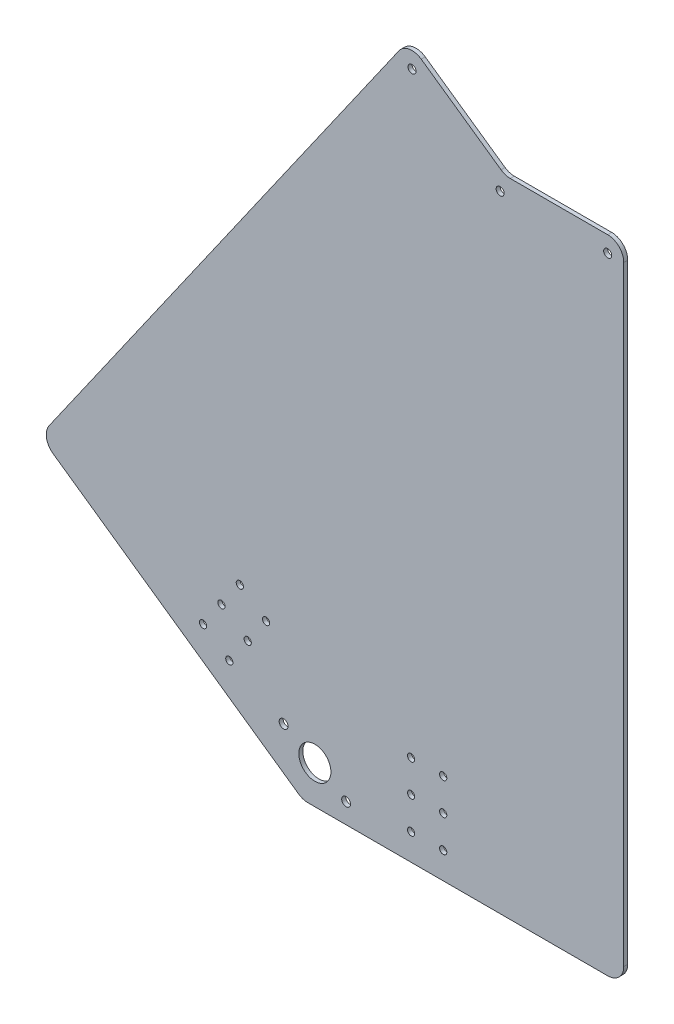
ISO-10303-21;
HEADER;
FILE_DESCRIPTION(('STEP AP214'),'2;1');
FILE_NAME('part.step','',(''),(''),'','','');
FILE_SCHEMA(('AUTOMOTIVE_DESIGN { 1 0 10303 214 1 1 1 1 }'));
ENDSEC;
DATA;
#1=APPLICATION_CONTEXT('core data for automotive mechanical design processes');
#2=APPLICATION_PROTOCOL_DEFINITION('international standard','automotive_design',2000,#1);
#3=PRODUCT_CONTEXT('',#1,'mechanical');
#4=PRODUCT('Part','Part','',(#3));
#5=PRODUCT_RELATED_PRODUCT_CATEGORY('part','',(#4));
#6=PRODUCT_DEFINITION_FORMATION('','',#4);
#7=PRODUCT_DEFINITION_CONTEXT('part definition',#1,'design');
#8=PRODUCT_DEFINITION('design','',#6,#7);
#9=PRODUCT_DEFINITION_SHAPE('','',#8);
#10=(LENGTH_UNIT() NAMED_UNIT(*) SI_UNIT(.MILLI.,.METRE.));
#11=(NAMED_UNIT(*) PLANE_ANGLE_UNIT() SI_UNIT($,.RADIAN.));
#12=(NAMED_UNIT(*) SI_UNIT($,.STERADIAN.) SOLID_ANGLE_UNIT());
#13=UNCERTAINTY_MEASURE_WITH_UNIT(LENGTH_MEASURE(1.E-05),#10,'distance_accuracy_value','');
#14=(GEOMETRIC_REPRESENTATION_CONTEXT(3) GLOBAL_UNCERTAINTY_ASSIGNED_CONTEXT((#13)) GLOBAL_UNIT_ASSIGNED_CONTEXT((#10,
#11,#12)) REPRESENTATION_CONTEXT('',''));
#15=CARTESIAN_POINT('',(0.,0.,0.));
#16=DIRECTION('',(0.,0.,1.));
#17=DIRECTION('',(1.,0.,0.));
#18=AXIS2_PLACEMENT_3D('',#15,#16,#17);
#19=CARTESIAN_POINT('',(-327.660817715596,229.430574540419,-5.));
#20=DIRECTION('',(-0.573576436351047,-0.819152044288991,0.));
#21=DIRECTION('',(0.819152044288991,-0.573576436351047,0.));
#22=AXIS2_PLACEMENT_3D('',#19,#20,#21);
#23=PLANE('',#22);
#24=DIRECTION('',(0.819152044288991,-0.573576436351047,0.));
#25=VECTOR('',#24,1.);
#26=CARTESIAN_POINT('',(-327.660817715596,229.430574540419,-5.));
#27=LINE('',#26,#25);
#28=CARTESIAN_POINT('',(-311.277776829817,217.959045813398,-5.));
#29=VERTEX_POINT('',#28);
#30=CARTESIAN_POINT('',(-5.16555294944127,3.61695911422019,-5.));
#31=VERTEX_POINT('',#30);
#32=EDGE_CURVE('E236',#29,#31,#27,.T.);
#33=ORIENTED_EDGE('',*,*,#32,.T.);
#34=DIRECTION('',(0.,0.,1.));
#35=VECTOR('',#34,1.);
#36=CARTESIAN_POINT('',(-5.16555294944127,3.61695911422016,-5.));
#37=LINE('',#36,#35);
#38=CARTESIAN_POINT('',(-5.16555294944127,3.61695911422019,0.));
#39=VERTEX_POINT('',#38);
#40=EDGE_CURVE('E183',#31,#39,#37,.T.);
#41=ORIENTED_EDGE('',*,*,#40,.T.);
#42=DIRECTION('',(0.819152044288991,-0.573576436351047,0.));
#43=VECTOR('',#42,1.);
#44=CARTESIAN_POINT('',(-327.660817715596,229.430574540419,0.));
#45=LINE('',#44,#43);
#46=CARTESIAN_POINT('',(-311.277776829817,217.959045813398,0.));
#47=VERTEX_POINT('',#46);
#48=EDGE_CURVE('E130',#47,#39,#45,.T.);
#49=ORIENTED_EDGE('',*,*,#48,.F.);
#50=DIRECTION('',(0.,0.,1.));
#51=VECTOR('',#50,1.);
#52=CARTESIAN_POINT('',(-311.277776829817,217.959045813398,-5.));
#53=LINE('',#52,#51);
#54=EDGE_CURVE('E181',#47,#29,#53,.F.);
#55=ORIENTED_EDGE('',*,*,#54,.T.);
#56=EDGE_LOOP('',(#33,#41,#49,#55));
#57=FACE_BOUND('',#56,.T.);
#58=ADVANCED_FACE('F36',(#57),#23,.T.);
#59=CARTESIAN_POINT('',(131.200331365241,884.752209971612,-5.));
#60=DIRECTION('',(-0.819152044288991,0.573576436351047,0.));
#61=DIRECTION('',(-0.573576436351047,-0.819152044288991,0.));
#62=AXIS2_PLACEMENT_3D('',#59,#60,#61);
#63=PLANE('',#62);
#64=DIRECTION('',(-0.573576436351047,-0.819152044288991,0.));
#65=VECTOR('',#64,1.);
#66=CARTESIAN_POINT('',(131.200331365241,884.752209971612,-5.));
#67=LINE('',#66,#65);
#68=CARTESIAN_POINT('',(119.72880263822,868.369169085832,-5.));
#69=VERTEX_POINT('',#68);
#70=CARTESIAN_POINT('',(-316.189288988576,245.813615426199,-5.));
#71=VERTEX_POINT('',#70);
#72=EDGE_CURVE('E151',#69,#71,#67,.T.);
#73=ORIENTED_EDGE('',*,*,#72,.T.);
#74=DIRECTION('',(0.,0.,1.));
#75=VECTOR('',#74,1.);
#76=CARTESIAN_POINT('',(-316.189288988575,245.813615426199,-5.));
#77=LINE('',#76,#75);
#78=CARTESIAN_POINT('',(-316.189288988576,245.813615426199,0.));
#79=VERTEX_POINT('',#78);
#80=EDGE_CURVE('E187',#71,#79,#77,.T.);
#81=ORIENTED_EDGE('',*,*,#80,.T.);
#82=DIRECTION('',(-0.573576436351047,-0.819152044288991,0.));
#83=VECTOR('',#82,1.);
#84=CARTESIAN_POINT('',(131.200331365241,884.752209971612,0.));
#85=LINE('',#84,#83);
#86=CARTESIAN_POINT('',(119.72880263822,868.369169085832,0.));
#87=VERTEX_POINT('',#86);
#88=EDGE_CURVE('E159',#87,#79,#85,.T.);
#89=ORIENTED_EDGE('',*,*,#88,.F.);
#90=DIRECTION('',(0.,0.,1.));
#91=VECTOR('',#90,1.);
#92=CARTESIAN_POINT('',(119.72880263822,868.369169085832,-5.));
#93=LINE('',#92,#91);
#94=EDGE_CURVE('E185',#87,#69,#93,.F.);
#95=ORIENTED_EDGE('',*,*,#94,.T.);
#96=EDGE_LOOP('',(#73,#81,#89,#95));
#97=FACE_BOUND('',#96,.T.);
#98=ADVANCED_FACE('F404',(#97),#63,.T.);
#99=CARTESIAN_POINT('',(252.239031103188,800.,-5.));
#100=DIRECTION('',(0.573576436351046,0.819152044288992,0.));
#101=DIRECTION('',(-0.819152044288992,0.573576436351046,0.));
#102=AXIS2_PLACEMENT_3D('',#99,#100,#101);
#103=PLANE('',#102);
#104=DIRECTION('',(-0.819152044288992,0.573576436351046,0.));
#105=VECTOR('',#104,1.);
#106=CARTESIAN_POINT('',(252.239031103188,800.,0.));
#107=LINE('',#106,#105);
#108=CARTESIAN_POINT('',(247.073478153746,803.61695911422,0.));
#109=VERTEX_POINT('',#108);
#110=CARTESIAN_POINT('',(147.583372251021,873.280681244591,0.));
#111=VERTEX_POINT('',#110);
#112=EDGE_CURVE('E201',#109,#111,#107,.T.);
#113=ORIENTED_EDGE('',*,*,#112,.F.);
#114=DIRECTION('',(0.,0.,1.));
#115=VECTOR('',#114,1.);
#116=CARTESIAN_POINT('',(247.073478153746,803.61695911422,-5.));
#117=LINE('',#116,#115);
#118=CARTESIAN_POINT('',(247.073478153746,803.61695911422,-5.));
#119=VERTEX_POINT('',#118);
#120=EDGE_CURVE('E197',#109,#119,#117,.F.);
#121=ORIENTED_EDGE('',*,*,#120,.T.);
#122=DIRECTION('',(-0.819152044288992,0.573576436351046,0.));
#123=VECTOR('',#122,1.);
#124=CARTESIAN_POINT('',(252.239031103188,800.,-5.));
#125=LINE('',#124,#123);
#126=CARTESIAN_POINT('',(147.583372251021,873.280681244591,-5.));
#127=VERTEX_POINT('',#126);
#128=EDGE_CURVE('E156',#119,#127,#125,.T.);
#129=ORIENTED_EDGE('',*,*,#128,.T.);
#130=DIRECTION('',(0.,0.,1.));
#131=VECTOR('',#130,1.);
#132=CARTESIAN_POINT('',(147.583372251021,873.280681244591,-5.));
#133=LINE('',#132,#131);
#134=EDGE_CURVE('E194',#127,#111,#133,.T.);
#135=ORIENTED_EDGE('',*,*,#134,.T.);
#136=EDGE_LOOP('',(#113,#121,#129,#135));
#137=FACE_BOUND('',#136,.T.);
#138=ADVANCED_FACE('F207',(#137),#103,.T.);
#139=CARTESIAN_POINT('',(400.,800.,-5.));
#140=DIRECTION('',(0.,1.,0.));
#141=DIRECTION('',(0.,0.,1.));
#142=AXIS2_PLACEMENT_3D('',#139,#140,#141);
#143=PLANE('',#142);
#144=DIRECTION('',(-1.,0.,0.));
#145=VECTOR('',#144,1.);
#146=CARTESIAN_POINT('',(400.,800.,-5.));
#147=LINE('',#146,#145);
#148=CARTESIAN_POINT('',(380.,800.,-5.));
#149=VERTEX_POINT('',#148);
#150=CARTESIAN_POINT('',(258.545006880767,800.,-5.));
#151=VERTEX_POINT('',#150);
#152=EDGE_CURVE('E212',#149,#151,#147,.T.);
#153=ORIENTED_EDGE('',*,*,#152,.T.);
#154=DIRECTION('',(0.,0.,1.));
#155=VECTOR('',#154,1.);
#156=CARTESIAN_POINT('',(258.545006880767,800.,0.));
#157=LINE('',#156,#155);
#158=CARTESIAN_POINT('',(258.545006880767,800.,0.));
#159=VERTEX_POINT('',#158);
#160=EDGE_CURVE('E191',#151,#159,#157,.T.);
#161=ORIENTED_EDGE('',*,*,#160,.T.);
#162=DIRECTION('',(-1.,0.,0.));
#163=VECTOR('',#162,1.);
#164=CARTESIAN_POINT('',(400.,800.,0.));
#165=LINE('',#164,#163);
#166=CARTESIAN_POINT('',(380.,800.,0.));
#167=VERTEX_POINT('',#166);
#168=EDGE_CURVE('E202',#167,#159,#165,.T.);
#169=ORIENTED_EDGE('',*,*,#168,.F.);
#170=DIRECTION('',(0.,0.,1.));
#171=VECTOR('',#170,1.);
#172=CARTESIAN_POINT('',(380.,800.,-5.));
#173=LINE('',#172,#171);
#174=EDGE_CURVE('E56',#167,#149,#173,.F.);
#175=ORIENTED_EDGE('',*,*,#174,.T.);
#176=EDGE_LOOP('',(#153,#161,#169,#175));
#177=FACE_BOUND('',#176,.T.);
#178=ADVANCED_FACE('F211',(#177),#143,.T.);
#179=CARTESIAN_POINT('',(400.,0.,-5.));
#180=DIRECTION('',(1.,0.,0.));
#181=DIRECTION('',(0.,0.,-1.));
#182=AXIS2_PLACEMENT_3D('',#179,#180,#181);
#183=PLANE('',#182);
#184=DIRECTION('',(0.,1.,0.));
#185=VECTOR('',#184,1.);
#186=CARTESIAN_POINT('',(400.,0.,0.));
#187=LINE('',#186,#185);
#188=CARTESIAN_POINT('',(400.,20.,0.));
#189=VERTEX_POINT('',#188);
#190=CARTESIAN_POINT('',(400.,780.,0.));
#191=VERTEX_POINT('',#190);
#192=EDGE_CURVE('E146',#189,#191,#187,.T.);
#193=ORIENTED_EDGE('',*,*,#192,.F.);
#194=DIRECTION('',(0.,0.,1.));
#195=VECTOR('',#194,1.);
#196=CARTESIAN_POINT('',(400.,20.,-5.));
#197=LINE('',#196,#195);
#198=CARTESIAN_POINT('',(400.,20.,-5.));
#199=VERTEX_POINT('',#198);
#200=EDGE_CURVE('E170',#189,#199,#197,.F.);
#201=ORIENTED_EDGE('',*,*,#200,.T.);
#202=DIRECTION('',(0.,1.,0.));
#203=VECTOR('',#202,1.);
#204=CARTESIAN_POINT('',(400.,0.,-5.));
#205=LINE('',#204,#203);
#206=CARTESIAN_POINT('',(400.,780.,-5.));
#207=VERTEX_POINT('',#206);
#208=EDGE_CURVE('E214',#199,#207,#205,.T.);
#209=ORIENTED_EDGE('',*,*,#208,.T.);
#210=DIRECTION('',(0.,0.,1.));
#211=VECTOR('',#210,1.);
#212=CARTESIAN_POINT('',(400.,780.,-5.));
#213=LINE('',#212,#211);
#214=EDGE_CURVE('E167',#207,#191,#213,.T.);
#215=ORIENTED_EDGE('',*,*,#214,.T.);
#216=EDGE_LOOP('',(#193,#201,#209,#215));
#217=FACE_BOUND('',#216,.T.);
#218=ADVANCED_FACE('F229',(#217),#183,.T.);
#219=CARTESIAN_POINT('',(0.,0.,-5.));
#220=DIRECTION('',(0.,-1.,0.));
#221=DIRECTION('',(0.,0.,-1.));
#222=AXIS2_PLACEMENT_3D('',#219,#220,#221);
#223=PLANE('',#222);
#224=DIRECTION('',(1.,0.,0.));
#225=VECTOR('',#224,1.);
#226=CARTESIAN_POINT('',(0.,0.,-5.));
#227=LINE('',#226,#225);
#228=CARTESIAN_POINT('',(6.30597577757969,0.,-5.));
#229=VERTEX_POINT('',#228);
#230=CARTESIAN_POINT('',(380.,0.,-5.));
#231=VERTEX_POINT('',#230);
#232=EDGE_CURVE('E218',#229,#231,#227,.T.);
#233=ORIENTED_EDGE('',*,*,#232,.T.);
#234=DIRECTION('',(0.,0.,1.));
#235=VECTOR('',#234,1.);
#236=CARTESIAN_POINT('',(380.,0.,-5.));
#237=LINE('',#236,#235);
#238=CARTESIAN_POINT('',(380.,0.,0.));
#239=VERTEX_POINT('',#238);
#240=EDGE_CURVE('E145',#231,#239,#237,.T.);
#241=ORIENTED_EDGE('',*,*,#240,.T.);
#242=DIRECTION('',(1.,0.,0.));
#243=VECTOR('',#242,1.);
#244=CARTESIAN_POINT('',(0.,0.,0.));
#245=LINE('',#244,#243);
#246=CARTESIAN_POINT('',(6.30597577757969,0.,0.));
#247=VERTEX_POINT('',#246);
#248=EDGE_CURVE('E128',#247,#239,#245,.T.);
#249=ORIENTED_EDGE('',*,*,#248,.F.);
#250=DIRECTION('',(0.,0.,1.));
#251=VECTOR('',#250,1.);
#252=CARTESIAN_POINT('',(6.30597577757969,0.,-5.));
#253=LINE('',#252,#251);
#254=EDGE_CURVE('E142',#247,#229,#253,.F.);
#255=ORIENTED_EDGE('',*,*,#254,.T.);
#256=EDGE_LOOP('',(#233,#241,#249,#255));
#257=FACE_BOUND('',#256,.T.);
#258=ADVANCED_FACE('F141',(#257),#223,.T.);
#259=CARTESIAN_POINT('',(0.,0.,-5.));
#260=DIRECTION('',(0.,0.,-1.));
#261=DIRECTION('',(-1.,0.,0.));
#262=AXIS2_PLACEMENT_3D('',#259,#260,#261);
#263=PLANE('',#262);
#264=CARTESIAN_POINT('',(-124.404492941578,127.394525173978,-5.));
#265=DIRECTION('',(0.,0.,1.));
#266=DIRECTION('',(1.,0.,0.));
#267=AXIS2_PLACEMENT_3D('',#264,#265,#266);
#268=CIRCLE('',#267,4.5);
#269=CARTESIAN_POINT('',(-119.904492941578,127.394525173978,-5.));
#270=VERTEX_POINT('',#269);
#271=EDGE_CURVE('E341',#270,#270,#268,.T.);
#272=ORIENTED_EDGE('',*,*,#271,.T.);
#273=EDGE_LOOP('',(#272));
#274=FACE_BOUND('',#273,.T.);
#275=CARTESIAN_POINT('',(-78.5183780334941,192.926688717097,-5.));
#276=DIRECTION('',(0.,0.,1.));
#277=DIRECTION('',(1.,0.,0.));
#278=AXIS2_PLACEMENT_3D('',#275,#276,#277);
#279=CIRCLE('',#278,4.5);
#280=CARTESIAN_POINT('',(-74.0183780334941,192.926688717097,-5.));
#281=VERTEX_POINT('',#280);
#282=EDGE_CURVE('E335',#281,#281,#279,.T.);
#283=ORIENTED_EDGE('',*,*,#282,.T.);
#284=EDGE_LOOP('',(#283));
#285=FACE_BOUND('',#284,.T.);
#286=CARTESIAN_POINT('',(-45.7522962619345,169.983631263055,-5.));
#287=DIRECTION('',(0.,0.,1.));
#288=DIRECTION('',(1.,0.,0.));
#289=AXIS2_PLACEMENT_3D('',#286,#287,#288);
#290=CIRCLE('',#289,4.5);
#291=CARTESIAN_POINT('',(-41.2522962619345,169.983631263055,-5.));
#292=VERTEX_POINT('',#291);
#293=EDGE_CURVE('E329',#292,#292,#290,.T.);
#294=ORIENTED_EDGE('',*,*,#293,.T.);
#295=EDGE_LOOP('',(#294));
#296=FACE_BOUND('',#295,.T.);
#297=CARTESIAN_POINT('',(-91.6384111700183,104.451467719936,-5.));
#298=DIRECTION('',(0.,0.,1.));
#299=DIRECTION('',(1.,0.,0.));
#300=AXIS2_PLACEMENT_3D('',#297,#298,#299);
#301=CIRCLE('',#300,4.5);
#302=CARTESIAN_POINT('',(-87.1384111700182,104.451467719936,-5.));
#303=VERTEX_POINT('',#302);
#304=EDGE_CURVE('E323',#303,#303,#301,.T.);
#305=ORIENTED_EDGE('',*,*,#304,.T.);
#306=EDGE_LOOP('',(#305));
#307=FACE_BOUND('',#306,.T.);
#308=CARTESIAN_POINT('',(-101.461435487536,160.160606945537,-5.));
#309=DIRECTION('',(0.,0.,1.));
#310=DIRECTION('',(1.,0.,0.));
#311=AXIS2_PLACEMENT_3D('',#308,#309,#310);
#312=CIRCLE('',#311,4.5);
#313=CARTESIAN_POINT('',(-96.961435487536,160.160606945537,-5.));
#314=VERTEX_POINT('',#313);
#315=EDGE_CURVE('E317',#314,#314,#312,.T.);
#316=ORIENTED_EDGE('',*,*,#315,.T.);
#317=EDGE_LOOP('',(#316));
#318=FACE_BOUND('',#317,.T.);
#319=CARTESIAN_POINT('',(-68.6953537159764,137.217549491495,-5.));
#320=DIRECTION('',(0.,0.,1.));
#321=DIRECTION('',(1.,0.,0.));
#322=AXIS2_PLACEMENT_3D('',#319,#320,#321);
#323=CIRCLE('',#322,4.5);
#324=CARTESIAN_POINT('',(-64.1953537159764,137.217549491495,-5.));
#325=VERTEX_POINT('',#324);
#326=EDGE_CURVE('E311',#325,#325,#323,.T.);
#327=ORIENTED_EDGE('',*,*,#326,.T.);
#328=EDGE_LOOP('',(#327));
#329=FACE_BOUND('',#328,.T.);
#330=CARTESIAN_POINT('',(134.976692471753,113.,-5.));
#331=DIRECTION('',(0.,0.,1.));
#332=DIRECTION('',(1.,0.,0.));
#333=AXIS2_PLACEMENT_3D('',#330,#331,#332);
#334=CIRCLE('',#333,4.5);
#335=CARTESIAN_POINT('',(139.476692471753,113.,-5.));
#336=VERTEX_POINT('',#335);
#337=EDGE_CURVE('E305',#336,#336,#334,.T.);
#338=ORIENTED_EDGE('',*,*,#337,.T.);
#339=EDGE_LOOP('',(#338));
#340=FACE_BOUND('',#339,.T.);
#341=CARTESIAN_POINT('',(174.976692471753,33.,-5.));
#342=DIRECTION('',(0.,0.,1.));
#343=DIRECTION('',(1.,0.,0.));
#344=AXIS2_PLACEMENT_3D('',#341,#342,#343);
#345=CIRCLE('',#344,4.5);
#346=CARTESIAN_POINT('',(179.476692471753,33.,-5.));
#347=VERTEX_POINT('',#346);
#348=EDGE_CURVE('E299',#347,#347,#345,.T.);
#349=ORIENTED_EDGE('',*,*,#348,.T.);
#350=EDGE_LOOP('',(#349));
#351=FACE_BOUND('',#350,.T.);
#352=CARTESIAN_POINT('',(134.976692471753,33.,-5.));
#353=DIRECTION('',(0.,0.,1.));
#354=DIRECTION('',(1.,0.,0.));
#355=AXIS2_PLACEMENT_3D('',#352,#353,#354);
#356=CIRCLE('',#355,4.5);
#357=CARTESIAN_POINT('',(139.476692471753,33.,-5.));
#358=VERTEX_POINT('',#357);
#359=EDGE_CURVE('E293',#358,#358,#356,.T.);
#360=ORIENTED_EDGE('',*,*,#359,.T.);
#361=EDGE_LOOP('',(#360));
#362=FACE_BOUND('',#361,.T.);
#363=CARTESIAN_POINT('',(174.976692471753,113.,-5.));
#364=DIRECTION('',(0.,0.,1.));
#365=DIRECTION('',(1.,0.,0.));
#366=AXIS2_PLACEMENT_3D('',#363,#364,#365);
#367=CIRCLE('',#366,4.5);
#368=CARTESIAN_POINT('',(179.476692471753,113.,-5.));
#369=VERTEX_POINT('',#368);
#370=EDGE_CURVE('E287',#369,#369,#367,.T.);
#371=ORIENTED_EDGE('',*,*,#370,.T.);
#372=EDGE_LOOP('',(#371));
#373=FACE_BOUND('',#372,.T.);
#374=CARTESIAN_POINT('',(134.976692471753,73.,-5.));
#375=DIRECTION('',(0.,0.,1.));
#376=DIRECTION('',(1.,0.,0.));
#377=AXIS2_PLACEMENT_3D('',#374,#375,#376);
#378=CIRCLE('',#377,4.5);
#379=CARTESIAN_POINT('',(139.476692471753,73.,-5.));
#380=VERTEX_POINT('',#379);
#381=EDGE_CURVE('E281',#380,#380,#378,.T.);
#382=ORIENTED_EDGE('',*,*,#381,.T.);
#383=EDGE_LOOP('',(#382));
#384=FACE_BOUND('',#383,.T.);
#385=CARTESIAN_POINT('',(174.976692471753,73.,-5.));
#386=DIRECTION('',(0.,0.,1.));
#387=DIRECTION('',(1.,0.,0.));
#388=AXIS2_PLACEMENT_3D('',#385,#386,#387);
#389=CIRCLE('',#388,4.5);
#390=CARTESIAN_POINT('',(179.476692471753,73.,-5.));
#391=VERTEX_POINT('',#390);
#392=EDGE_CURVE('E275',#391,#391,#389,.T.);
#393=ORIENTED_EDGE('',*,*,#392,.T.);
#394=EDGE_LOOP('',(#393));
#395=FACE_BOUND('',#394,.T.);
#396=CARTESIAN_POINT('',(-23.994450698547,70.0000000000031,-5.));
#397=DIRECTION('',(0.,0.,1.));
#398=DIRECTION('',(1.,0.,0.));
#399=AXIS2_PLACEMENT_3D('',#396,#397,#398);
#400=CIRCLE('',#399,5.5);
#401=CARTESIAN_POINT('',(-18.494450698547,70.0000000000031,-5.));
#402=VERTEX_POINT('',#401);
#403=EDGE_CURVE('E269',#402,#402,#400,.T.);
#404=ORIENTED_EDGE('',*,*,#403,.T.);
#405=EDGE_LOOP('',(#404));
#406=FACE_BOUND('',#405,.T.);
#407=CARTESIAN_POINT('',(53.9478356420524,25.0000000000031,-5.));
#408=DIRECTION('',(0.,0.,1.));
#409=DIRECTION('',(1.,0.,0.));
#410=AXIS2_PLACEMENT_3D('',#407,#408,#409);
#411=CIRCLE('',#410,5.5);
#412=CARTESIAN_POINT('',(59.4478356420524,25.0000000000031,-5.));
#413=VERTEX_POINT('',#412);
#414=EDGE_CURVE('E261',#413,#413,#411,.T.);
#415=ORIENTED_EDGE('',*,*,#414,.T.);
#416=EDGE_LOOP('',(#415));
#417=FACE_BOUND('',#416,.T.);
#418=CARTESIAN_POINT('',(14.9766924717527,47.5000000000031,-5.));
#419=DIRECTION('',(0.,0.,1.));
#420=DIRECTION('',(1.,0.,0.));
#421=AXIS2_PLACEMENT_3D('',#418,#419,#420);
#422=CIRCLE('',#421,20.);
#423=CARTESIAN_POINT('',(34.9766924717527,47.5000000000031,-5.));
#424=VERTEX_POINT('',#423);
#425=EDGE_CURVE('E257',#424,#424,#422,.T.);
#426=ORIENTED_EDGE('',*,*,#425,.T.);
#427=EDGE_LOOP('',(#426));
#428=FACE_BOUND('',#427,.T.);
#429=CARTESIAN_POINT('',(245.933055325608,780.,-5.));
#430=DIRECTION('',(0.,0.,1.));
#431=DIRECTION('',(1.,0.,0.));
#432=AXIS2_PLACEMENT_3D('',#429,#430,#431);
#433=CIRCLE('',#432,4.99999999999998);
#434=CARTESIAN_POINT('',(250.933055325608,780.,-5.));
#435=VERTEX_POINT('',#434);
#436=EDGE_CURVE('E251',#435,#435,#433,.T.);
#437=ORIENTED_EDGE('',*,*,#436,.T.);
#438=EDGE_LOOP('',(#437));
#439=FACE_BOUND('',#438,.T.);
#440=CARTESIAN_POINT('',(136.111843524,856.897640358811,-5.));
#441=DIRECTION('',(0.,0.,1.));
#442=DIRECTION('',(1.,0.,0.));
#443=AXIS2_PLACEMENT_3D('',#440,#441,#442);
#444=CIRCLE('',#443,5.);
#445=CARTESIAN_POINT('',(141.111843524,856.897640358811,-5.));
#446=VERTEX_POINT('',#445);
#447=EDGE_CURVE('E245',#446,#446,#444,.T.);
#448=ORIENTED_EDGE('',*,*,#447,.T.);
#449=EDGE_LOOP('',(#448));
#450=FACE_BOUND('',#449,.T.);
#451=CARTESIAN_POINT('',(380.,780.,-5.));
#452=DIRECTION('',(0.,0.,1.));
#453=DIRECTION('',(1.,0.,0.));
#454=AXIS2_PLACEMENT_3D('',#451,#452,#453);
#455=CIRCLE('',#454,5.);
#456=CARTESIAN_POINT('',(385.,780.,-5.));
#457=VERTEX_POINT('',#456);
#458=EDGE_CURVE('E222',#457,#457,#455,.T.);
#459=ORIENTED_EDGE('',*,*,#458,.T.);
#460=EDGE_LOOP('',(#459));
#461=FACE_BOUND('',#460,.T.);
#462=ORIENTED_EDGE('',*,*,#208,.F.);
#463=CARTESIAN_POINT('',(380.,20.,-5.));
#464=DIRECTION('',(0.,0.,-1.));
#465=DIRECTION('',(-1.,0.,0.));
#466=AXIS2_PLACEMENT_3D('',#463,#464,#465);
#467=CIRCLE('',#466,20.);
#468=EDGE_CURVE('E179',#199,#231,#467,.T.);
#469=ORIENTED_EDGE('',*,*,#468,.T.);
#470=ORIENTED_EDGE('',*,*,#232,.F.);
#471=CARTESIAN_POINT('',(6.30597577757969,20.,-5.));
#472=DIRECTION('',(0.,0.,-1.));
#473=DIRECTION('',(-1.,0.,0.));
#474=AXIS2_PLACEMENT_3D('',#471,#472,#473);
#475=CIRCLE('',#474,20.);
#476=EDGE_CURVE('E150',#229,#31,#475,.T.);
#477=ORIENTED_EDGE('',*,*,#476,.T.);
#478=ORIENTED_EDGE('',*,*,#32,.F.);
#479=CARTESIAN_POINT('',(-299.806248102796,234.342086699178,-5.));
#480=DIRECTION('',(0.,0.,-1.));
#481=DIRECTION('',(-1.,0.,0.));
#482=AXIS2_PLACEMENT_3D('',#479,#480,#481);
#483=CIRCLE('',#482,20.);
#484=EDGE_CURVE('E176',#29,#71,#483,.T.);
#485=ORIENTED_EDGE('',*,*,#484,.T.);
#486=ORIENTED_EDGE('',*,*,#72,.F.);
#487=CARTESIAN_POINT('',(136.111843524,856.897640358811,-5.));
#488=DIRECTION('',(0.,0.,-1.));
#489=DIRECTION('',(-1.,0.,0.));
#490=AXIS2_PLACEMENT_3D('',#487,#488,#489);
#491=CIRCLE('',#490,20.);
#492=EDGE_CURVE('E172',#69,#127,#491,.T.);
#493=ORIENTED_EDGE('',*,*,#492,.T.);
#494=ORIENTED_EDGE('',*,*,#128,.F.);
#495=CARTESIAN_POINT('',(258.545006880767,820.,-5.));
#496=DIRECTION('',(0.,0.,-1.));
#497=DIRECTION('',(-1.,0.,0.));
#498=AXIS2_PLACEMENT_3D('',#495,#496,#497);
#499=CIRCLE('',#498,20.);
#500=EDGE_CURVE('E11',#119,#151,#499,.F.);
#501=ORIENTED_EDGE('',*,*,#500,.T.);
#502=ORIENTED_EDGE('',*,*,#152,.F.);
#503=CARTESIAN_POINT('',(380.,780.,-5.));
#504=DIRECTION('',(0.,0.,-1.));
#505=DIRECTION('',(-1.,0.,0.));
#506=AXIS2_PLACEMENT_3D('',#503,#504,#505);
#507=CIRCLE('',#506,20.);
#508=EDGE_CURVE('E174',#149,#207,#507,.T.);
#509=ORIENTED_EDGE('',*,*,#508,.T.);
#510=EDGE_LOOP('',(#462,#469,#470,#477,#478,#485,#486,#493,#494,#501,#502,#509));
#511=FACE_BOUND('',#510,.T.);
#512=ADVANCED_FACE('F235',(#274,#285,#296,#307,#318,#329,#340,#351,#362,#373,#384,#395,#406,
#417,#428,#439,#450,#461,#511),#263,.T.);
#513=CARTESIAN_POINT('',(0.,0.,0.));
#514=DIRECTION('',(0.,0.,-1.));
#515=DIRECTION('',(-1.,0.,0.));
#516=AXIS2_PLACEMENT_3D('',#513,#514,#515);
#517=PLANE('',#516);
#518=CARTESIAN_POINT('',(-124.404492941578,127.394525173978,0.));
#519=DIRECTION('',(0.,0.,1.));
#520=DIRECTION('',(1.,0.,0.));
#521=AXIS2_PLACEMENT_3D('',#518,#519,#520);
#522=CIRCLE('',#521,4.5);
#523=CARTESIAN_POINT('',(-119.904492941578,127.394525173978,0.));
#524=VERTEX_POINT('',#523);
#525=EDGE_CURVE('E344',#524,#524,#522,.T.);
#526=ORIENTED_EDGE('',*,*,#525,.F.);
#527=EDGE_LOOP('',(#526));
#528=FACE_BOUND('',#527,.T.);
#529=CARTESIAN_POINT('',(-78.5183780334941,192.926688717097,0.));
#530=DIRECTION('',(0.,0.,1.));
#531=DIRECTION('',(1.,0.,0.));
#532=AXIS2_PLACEMENT_3D('',#529,#530,#531);
#533=CIRCLE('',#532,4.5);
#534=CARTESIAN_POINT('',(-74.0183780334941,192.926688717097,0.));
#535=VERTEX_POINT('',#534);
#536=EDGE_CURVE('E338',#535,#535,#533,.T.);
#537=ORIENTED_EDGE('',*,*,#536,.F.);
#538=EDGE_LOOP('',(#537));
#539=FACE_BOUND('',#538,.T.);
#540=CARTESIAN_POINT('',(-45.7522962619345,169.983631263055,0.));
#541=DIRECTION('',(0.,0.,1.));
#542=DIRECTION('',(1.,0.,0.));
#543=AXIS2_PLACEMENT_3D('',#540,#541,#542);
#544=CIRCLE('',#543,4.5);
#545=CARTESIAN_POINT('',(-41.2522962619345,169.983631263055,0.));
#546=VERTEX_POINT('',#545);
#547=EDGE_CURVE('E332',#546,#546,#544,.T.);
#548=ORIENTED_EDGE('',*,*,#547,.F.);
#549=EDGE_LOOP('',(#548));
#550=FACE_BOUND('',#549,.T.);
#551=CARTESIAN_POINT('',(-91.6384111700183,104.451467719936,0.));
#552=DIRECTION('',(0.,0.,1.));
#553=DIRECTION('',(1.,0.,0.));
#554=AXIS2_PLACEMENT_3D('',#551,#552,#553);
#555=CIRCLE('',#554,4.5);
#556=CARTESIAN_POINT('',(-87.1384111700182,104.451467719936,0.));
#557=VERTEX_POINT('',#556);
#558=EDGE_CURVE('E326',#557,#557,#555,.T.);
#559=ORIENTED_EDGE('',*,*,#558,.F.);
#560=EDGE_LOOP('',(#559));
#561=FACE_BOUND('',#560,.T.);
#562=CARTESIAN_POINT('',(-101.461435487536,160.160606945537,0.));
#563=DIRECTION('',(0.,0.,1.));
#564=DIRECTION('',(1.,0.,0.));
#565=AXIS2_PLACEMENT_3D('',#562,#563,#564);
#566=CIRCLE('',#565,4.5);
#567=CARTESIAN_POINT('',(-96.961435487536,160.160606945537,0.));
#568=VERTEX_POINT('',#567);
#569=EDGE_CURVE('E320',#568,#568,#566,.T.);
#570=ORIENTED_EDGE('',*,*,#569,.F.);
#571=EDGE_LOOP('',(#570));
#572=FACE_BOUND('',#571,.T.);
#573=CARTESIAN_POINT('',(-68.6953537159764,137.217549491495,0.));
#574=DIRECTION('',(0.,0.,1.));
#575=DIRECTION('',(1.,0.,0.));
#576=AXIS2_PLACEMENT_3D('',#573,#574,#575);
#577=CIRCLE('',#576,4.5);
#578=CARTESIAN_POINT('',(-64.1953537159764,137.217549491495,0.));
#579=VERTEX_POINT('',#578);
#580=EDGE_CURVE('E314',#579,#579,#577,.T.);
#581=ORIENTED_EDGE('',*,*,#580,.F.);
#582=EDGE_LOOP('',(#581));
#583=FACE_BOUND('',#582,.T.);
#584=CARTESIAN_POINT('',(134.976692471753,113.,0.));
#585=DIRECTION('',(0.,0.,1.));
#586=DIRECTION('',(1.,0.,0.));
#587=AXIS2_PLACEMENT_3D('',#584,#585,#586);
#588=CIRCLE('',#587,4.5);
#589=CARTESIAN_POINT('',(139.476692471753,113.,0.));
#590=VERTEX_POINT('',#589);
#591=EDGE_CURVE('E308',#590,#590,#588,.T.);
#592=ORIENTED_EDGE('',*,*,#591,.F.);
#593=EDGE_LOOP('',(#592));
#594=FACE_BOUND('',#593,.T.);
#595=CARTESIAN_POINT('',(174.976692471753,33.,0.));
#596=DIRECTION('',(0.,0.,1.));
#597=DIRECTION('',(1.,0.,0.));
#598=AXIS2_PLACEMENT_3D('',#595,#596,#597);
#599=CIRCLE('',#598,4.5);
#600=CARTESIAN_POINT('',(179.476692471753,33.,0.));
#601=VERTEX_POINT('',#600);
#602=EDGE_CURVE('E302',#601,#601,#599,.T.);
#603=ORIENTED_EDGE('',*,*,#602,.F.);
#604=EDGE_LOOP('',(#603));
#605=FACE_BOUND('',#604,.T.);
#606=CARTESIAN_POINT('',(134.976692471753,33.,0.));
#607=DIRECTION('',(0.,0.,1.));
#608=DIRECTION('',(1.,0.,0.));
#609=AXIS2_PLACEMENT_3D('',#606,#607,#608);
#610=CIRCLE('',#609,4.5);
#611=CARTESIAN_POINT('',(139.476692471753,33.,0.));
#612=VERTEX_POINT('',#611);
#613=EDGE_CURVE('E296',#612,#612,#610,.T.);
#614=ORIENTED_EDGE('',*,*,#613,.F.);
#615=EDGE_LOOP('',(#614));
#616=FACE_BOUND('',#615,.T.);
#617=CARTESIAN_POINT('',(174.976692471753,113.,0.));
#618=DIRECTION('',(0.,0.,1.));
#619=DIRECTION('',(1.,0.,0.));
#620=AXIS2_PLACEMENT_3D('',#617,#618,#619);
#621=CIRCLE('',#620,4.5);
#622=CARTESIAN_POINT('',(179.476692471753,113.,0.));
#623=VERTEX_POINT('',#622);
#624=EDGE_CURVE('E290',#623,#623,#621,.T.);
#625=ORIENTED_EDGE('',*,*,#624,.F.);
#626=EDGE_LOOP('',(#625));
#627=FACE_BOUND('',#626,.T.);
#628=CARTESIAN_POINT('',(134.976692471753,73.,0.));
#629=DIRECTION('',(0.,0.,1.));
#630=DIRECTION('',(1.,0.,0.));
#631=AXIS2_PLACEMENT_3D('',#628,#629,#630);
#632=CIRCLE('',#631,4.5);
#633=CARTESIAN_POINT('',(139.476692471753,73.,0.));
#634=VERTEX_POINT('',#633);
#635=EDGE_CURVE('E284',#634,#634,#632,.T.);
#636=ORIENTED_EDGE('',*,*,#635,.F.);
#637=EDGE_LOOP('',(#636));
#638=FACE_BOUND('',#637,.T.);
#639=CARTESIAN_POINT('',(174.976692471753,73.,0.));
#640=DIRECTION('',(0.,0.,1.));
#641=DIRECTION('',(1.,0.,0.));
#642=AXIS2_PLACEMENT_3D('',#639,#640,#641);
#643=CIRCLE('',#642,4.5);
#644=CARTESIAN_POINT('',(179.476692471753,73.,0.));
#645=VERTEX_POINT('',#644);
#646=EDGE_CURVE('E278',#645,#645,#643,.T.);
#647=ORIENTED_EDGE('',*,*,#646,.F.);
#648=EDGE_LOOP('',(#647));
#649=FACE_BOUND('',#648,.T.);
#650=CARTESIAN_POINT('',(-23.994450698547,70.0000000000031,0.));
#651=DIRECTION('',(0.,0.,1.));
#652=DIRECTION('',(1.,0.,0.));
#653=AXIS2_PLACEMENT_3D('',#650,#651,#652);
#654=CIRCLE('',#653,5.5);
#655=CARTESIAN_POINT('',(-18.494450698547,70.0000000000031,0.));
#656=VERTEX_POINT('',#655);
#657=EDGE_CURVE('E272',#656,#656,#654,.T.);
#658=ORIENTED_EDGE('',*,*,#657,.F.);
#659=EDGE_LOOP('',(#658));
#660=FACE_BOUND('',#659,.T.);
#661=CARTESIAN_POINT('',(53.9478356420524,25.0000000000031,0.));
#662=DIRECTION('',(0.,0.,1.));
#663=DIRECTION('',(1.,0.,0.));
#664=AXIS2_PLACEMENT_3D('',#661,#662,#663);
#665=CIRCLE('',#664,5.5);
#666=CARTESIAN_POINT('',(59.4478356420524,25.0000000000031,0.));
#667=VERTEX_POINT('',#666);
#668=EDGE_CURVE('E266',#667,#667,#665,.T.);
#669=ORIENTED_EDGE('',*,*,#668,.F.);
#670=EDGE_LOOP('',(#669));
#671=FACE_BOUND('',#670,.T.);
#672=CARTESIAN_POINT('',(14.9766924717527,47.5000000000031,0.));
#673=DIRECTION('',(0.,0.,1.));
#674=DIRECTION('',(1.,0.,0.));
#675=AXIS2_PLACEMENT_3D('',#672,#673,#674);
#676=CIRCLE('',#675,20.);
#677=CARTESIAN_POINT('',(34.9766924717527,47.5000000000031,0.));
#678=VERTEX_POINT('',#677);
#679=EDGE_CURVE('E258',#678,#678,#676,.T.);
#680=ORIENTED_EDGE('',*,*,#679,.F.);
#681=EDGE_LOOP('',(#680));
#682=FACE_BOUND('',#681,.T.);
#683=CARTESIAN_POINT('',(245.933055325608,780.,0.));
#684=DIRECTION('',(0.,0.,1.));
#685=DIRECTION('',(1.,0.,0.));
#686=AXIS2_PLACEMENT_3D('',#683,#684,#685);
#687=CIRCLE('',#686,4.99999999999998);
#688=CARTESIAN_POINT('',(250.933055325608,780.,0.));
#689=VERTEX_POINT('',#688);
#690=EDGE_CURVE('E254',#689,#689,#687,.T.);
#691=ORIENTED_EDGE('',*,*,#690,.F.);
#692=EDGE_LOOP('',(#691));
#693=FACE_BOUND('',#692,.T.);
#694=CARTESIAN_POINT('',(136.111843524,856.897640358811,0.));
#695=DIRECTION('',(0.,0.,1.));
#696=DIRECTION('',(1.,0.,0.));
#697=AXIS2_PLACEMENT_3D('',#694,#695,#696);
#698=CIRCLE('',#697,5.);
#699=CARTESIAN_POINT('',(141.111843524,856.897640358811,0.));
#700=VERTEX_POINT('',#699);
#701=EDGE_CURVE('E248',#700,#700,#698,.T.);
#702=ORIENTED_EDGE('',*,*,#701,.F.);
#703=EDGE_LOOP('',(#702));
#704=FACE_BOUND('',#703,.T.);
#705=CARTESIAN_POINT('',(380.,780.,0.));
#706=DIRECTION('',(0.,0.,1.));
#707=DIRECTION('',(1.,0.,0.));
#708=AXIS2_PLACEMENT_3D('',#705,#706,#707);
#709=CIRCLE('',#708,5.);
#710=CARTESIAN_POINT('',(385.,780.,0.));
#711=VERTEX_POINT('',#710);
#712=EDGE_CURVE('E242',#711,#711,#709,.T.);
#713=ORIENTED_EDGE('',*,*,#712,.F.);
#714=EDGE_LOOP('',(#713));
#715=FACE_BOUND('',#714,.T.);
#716=ORIENTED_EDGE('',*,*,#248,.T.);
#717=CARTESIAN_POINT('',(380.,20.,0.));
#718=DIRECTION('',(0.,0.,-1.));
#719=DIRECTION('',(-1.,0.,0.));
#720=AXIS2_PLACEMENT_3D('',#717,#718,#719);
#721=CIRCLE('',#720,20.);
#722=EDGE_CURVE('E135',#239,#189,#721,.F.);
#723=ORIENTED_EDGE('',*,*,#722,.T.);
#724=ORIENTED_EDGE('',*,*,#192,.T.);
#725=CARTESIAN_POINT('',(380.,780.,0.));
#726=DIRECTION('',(0.,0.,-1.));
#727=DIRECTION('',(-1.,0.,0.));
#728=AXIS2_PLACEMENT_3D('',#725,#726,#727);
#729=CIRCLE('',#728,20.);
#730=EDGE_CURVE('E163',#191,#167,#729,.F.);
#731=ORIENTED_EDGE('',*,*,#730,.T.);
#732=ORIENTED_EDGE('',*,*,#168,.T.);
#733=CARTESIAN_POINT('',(258.545006880767,820.,0.));
#734=DIRECTION('',(0.,0.,-1.));
#735=DIRECTION('',(-1.,0.,0.));
#736=AXIS2_PLACEMENT_3D('',#733,#734,#735);
#737=CIRCLE('',#736,20.);
#738=EDGE_CURVE('E44',#159,#109,#737,.T.);
#739=ORIENTED_EDGE('',*,*,#738,.T.);
#740=ORIENTED_EDGE('',*,*,#112,.T.);
#741=CARTESIAN_POINT('',(136.111843524,856.897640358811,0.));
#742=DIRECTION('',(0.,0.,-1.));
#743=DIRECTION('',(-1.,0.,0.));
#744=AXIS2_PLACEMENT_3D('',#741,#742,#743);
#745=CIRCLE('',#744,20.);
#746=EDGE_CURVE('E153',#111,#87,#745,.F.);
#747=ORIENTED_EDGE('',*,*,#746,.T.);
#748=ORIENTED_EDGE('',*,*,#88,.T.);
#749=CARTESIAN_POINT('',(-299.806248102796,234.342086699178,0.));
#750=DIRECTION('',(0.,0.,-1.));
#751=DIRECTION('',(-1.,0.,0.));
#752=AXIS2_PLACEMENT_3D('',#749,#750,#751);
#753=CIRCLE('',#752,20.);
#754=EDGE_CURVE('E136',#79,#47,#753,.F.);
#755=ORIENTED_EDGE('',*,*,#754,.T.);
#756=ORIENTED_EDGE('',*,*,#48,.T.);
#757=CARTESIAN_POINT('',(6.30597577757969,20.,0.));
#758=DIRECTION('',(0.,0.,-1.));
#759=DIRECTION('',(-1.,0.,0.));
#760=AXIS2_PLACEMENT_3D('',#757,#758,#759);
#761=CIRCLE('',#760,20.);
#762=EDGE_CURVE('E125',#39,#247,#761,.F.);
#763=ORIENTED_EDGE('',*,*,#762,.T.);
#764=EDGE_LOOP('',(#716,#723,#724,#731,#732,#739,#740,#747,#748,#755,#756,#763));
#765=FACE_BOUND('',#764,.T.);
#766=ADVANCED_FACE('F127',(#528,#539,#550,#561,#572,#583,#594,#605,#616,#627,#638,#649,#660,
#671,#682,#693,#704,#715,#765),#517,.F.);
#767=CARTESIAN_POINT('',(380.,20.,-5.));
#768=DIRECTION('',(0.,0.,1.));
#769=DIRECTION('',(1.,0.,0.));
#770=AXIS2_PLACEMENT_3D('',#767,#768,#769);
#771=CYLINDRICAL_SURFACE('',#770,20.);
#772=ORIENTED_EDGE('',*,*,#468,.F.);
#773=ORIENTED_EDGE('',*,*,#200,.F.);
#774=ORIENTED_EDGE('',*,*,#722,.F.);
#775=ORIENTED_EDGE('',*,*,#240,.F.);
#776=EDGE_LOOP('',(#772,#773,#774,#775));
#777=FACE_BOUND('',#776,.T.);
#778=ADVANCED_FACE('F234',(#777),#771,.T.);
#779=CARTESIAN_POINT('',(6.30597577757969,20.,-5.));
#780=DIRECTION('',(0.,0.,1.));
#781=DIRECTION('',(1.,0.,0.));
#782=AXIS2_PLACEMENT_3D('',#779,#780,#781);
#783=CYLINDRICAL_SURFACE('',#782,20.);
#784=ORIENTED_EDGE('',*,*,#476,.F.);
#785=ORIENTED_EDGE('',*,*,#254,.F.);
#786=ORIENTED_EDGE('',*,*,#762,.F.);
#787=ORIENTED_EDGE('',*,*,#40,.F.);
#788=EDGE_LOOP('',(#784,#785,#786,#787));
#789=FACE_BOUND('',#788,.T.);
#790=ADVANCED_FACE('F149',(#789),#783,.T.);
#791=CARTESIAN_POINT('',(-299.806248102796,234.342086699178,-5.));
#792=DIRECTION('',(0.,0.,1.));
#793=DIRECTION('',(1.,0.,0.));
#794=AXIS2_PLACEMENT_3D('',#791,#792,#793);
#795=CYLINDRICAL_SURFACE('',#794,20.);
#796=ORIENTED_EDGE('',*,*,#484,.F.);
#797=ORIENTED_EDGE('',*,*,#54,.F.);
#798=ORIENTED_EDGE('',*,*,#754,.F.);
#799=ORIENTED_EDGE('',*,*,#80,.F.);
#800=EDGE_LOOP('',(#796,#797,#798,#799));
#801=FACE_BOUND('',#800,.T.);
#802=ADVANCED_FACE('F419',(#801),#795,.T.);
#803=CARTESIAN_POINT('',(258.545006880767,820.,-5.));
#804=DIRECTION('',(0.,0.,-1.));
#805=DIRECTION('',(-1.,0.,0.));
#806=AXIS2_PLACEMENT_3D('',#803,#804,#805);
#807=CYLINDRICAL_SURFACE('',#806,20.);
#808=ORIENTED_EDGE('',*,*,#500,.F.);
#809=ORIENTED_EDGE('',*,*,#120,.F.);
#810=ORIENTED_EDGE('',*,*,#738,.F.);
#811=ORIENTED_EDGE('',*,*,#160,.F.);
#812=EDGE_LOOP('',(#808,#809,#810,#811));
#813=FACE_BOUND('',#812,.T.);
#814=ADVANCED_FACE('F210',(#813),#807,.F.);
#815=CARTESIAN_POINT('',(380.,780.,-5.));
#816=DIRECTION('',(0.,0.,1.));
#817=DIRECTION('',(1.,0.,0.));
#818=AXIS2_PLACEMENT_3D('',#815,#816,#817);
#819=CYLINDRICAL_SURFACE('',#818,20.);
#820=ORIENTED_EDGE('',*,*,#508,.F.);
#821=ORIENTED_EDGE('',*,*,#174,.F.);
#822=ORIENTED_EDGE('',*,*,#730,.F.);
#823=ORIENTED_EDGE('',*,*,#214,.F.);
#824=EDGE_LOOP('',(#820,#821,#822,#823));
#825=FACE_BOUND('',#824,.T.);
#826=ADVANCED_FACE('F399',(#825),#819,.T.);
#827=CARTESIAN_POINT('',(136.111843524,856.897640358811,-5.));
#828=DIRECTION('',(0.,0.,1.));
#829=DIRECTION('',(1.,0.,0.));
#830=AXIS2_PLACEMENT_3D('',#827,#828,#829);
#831=CYLINDRICAL_SURFACE('',#830,20.);
#832=ORIENTED_EDGE('',*,*,#492,.F.);
#833=ORIENTED_EDGE('',*,*,#94,.F.);
#834=ORIENTED_EDGE('',*,*,#746,.F.);
#835=ORIENTED_EDGE('',*,*,#134,.F.);
#836=EDGE_LOOP('',(#832,#833,#834,#835));
#837=FACE_BOUND('',#836,.T.);
#838=ADVANCED_FACE('F38',(#837),#831,.T.);
#839=CARTESIAN_POINT('',(380.,780.,0.));
#840=DIRECTION('',(0.,0.,1.));
#841=DIRECTION('',(1.,0.,0.));
#842=AXIS2_PLACEMENT_3D('',#839,#840,#841);
#843=CYLINDRICAL_SURFACE('',#842,5.);
#844=ORIENTED_EDGE('',*,*,#458,.F.);
#845=EDGE_LOOP('',(#844));
#846=FACE_BOUND('',#845,.T.);
#847=ORIENTED_EDGE('',*,*,#712,.T.);
#848=EDGE_LOOP('',(#847));
#849=FACE_BOUND('',#848,.T.);
#850=ADVANCED_FACE('F387',(#846,#849),#843,.F.);
#851=CARTESIAN_POINT('',(136.111843524,856.897640358811,0.));
#852=DIRECTION('',(0.,0.,1.));
#853=DIRECTION('',(1.,0.,0.));
#854=AXIS2_PLACEMENT_3D('',#851,#852,#853);
#855=CYLINDRICAL_SURFACE('',#854,5.);
#856=ORIENTED_EDGE('',*,*,#447,.F.);
#857=EDGE_LOOP('',(#856));
#858=FACE_BOUND('',#857,.T.);
#859=ORIENTED_EDGE('',*,*,#701,.T.);
#860=EDGE_LOOP('',(#859));
#861=FACE_BOUND('',#860,.T.);
#862=ADVANCED_FACE('F389',(#858,#861),#855,.F.);
#863=CARTESIAN_POINT('',(245.933055325608,780.,0.));
#864=DIRECTION('',(0.,0.,1.));
#865=DIRECTION('',(1.,0.,0.));
#866=AXIS2_PLACEMENT_3D('',#863,#864,#865);
#867=CYLINDRICAL_SURFACE('',#866,4.99999999999998);
#868=ORIENTED_EDGE('',*,*,#436,.F.);
#869=EDGE_LOOP('',(#868));
#870=FACE_BOUND('',#869,.T.);
#871=ORIENTED_EDGE('',*,*,#690,.T.);
#872=EDGE_LOOP('',(#871));
#873=FACE_BOUND('',#872,.T.);
#874=ADVANCED_FACE('F396',(#870,#873),#867,.F.);
#875=CARTESIAN_POINT('',(14.9766924717527,47.5000000000031,-5.));
#876=DIRECTION('',(0.,0.,1.));
#877=DIRECTION('',(1.,0.,0.));
#878=AXIS2_PLACEMENT_3D('',#875,#876,#877);
#879=CYLINDRICAL_SURFACE('',#878,20.);
#880=ORIENTED_EDGE('',*,*,#425,.F.);
#881=EDGE_LOOP('',(#880));
#882=FACE_BOUND('',#881,.T.);
#883=ORIENTED_EDGE('',*,*,#679,.T.);
#884=EDGE_LOOP('',(#883));
#885=FACE_BOUND('',#884,.T.);
#886=ADVANCED_FACE('F453',(#882,#885),#879,.F.);
#887=CARTESIAN_POINT('',(53.9478356420524,25.0000000000031,0.));
#888=DIRECTION('',(0.,0.,1.));
#889=DIRECTION('',(1.,0.,0.));
#890=AXIS2_PLACEMENT_3D('',#887,#888,#889);
#891=CYLINDRICAL_SURFACE('',#890,5.5);
#892=ORIENTED_EDGE('',*,*,#414,.F.);
#893=EDGE_LOOP('',(#892));
#894=FACE_BOUND('',#893,.T.);
#895=ORIENTED_EDGE('',*,*,#668,.T.);
#896=EDGE_LOOP('',(#895));
#897=FACE_BOUND('',#896,.T.);
#898=ADVANCED_FACE('F463',(#894,#897),#891,.F.);
#899=CARTESIAN_POINT('',(-23.994450698547,70.0000000000031,0.));
#900=DIRECTION('',(0.,0.,1.));
#901=DIRECTION('',(1.,0.,0.));
#902=AXIS2_PLACEMENT_3D('',#899,#900,#901);
#903=CYLINDRICAL_SURFACE('',#902,5.5);
#904=ORIENTED_EDGE('',*,*,#403,.F.);
#905=EDGE_LOOP('',(#904));
#906=FACE_BOUND('',#905,.T.);
#907=ORIENTED_EDGE('',*,*,#657,.T.);
#908=EDGE_LOOP('',(#907));
#909=FACE_BOUND('',#908,.T.);
#910=ADVANCED_FACE('F474',(#906,#909),#903,.F.);
#911=CARTESIAN_POINT('',(174.976692471753,73.,0.));
#912=DIRECTION('',(0.,0.,1.));
#913=DIRECTION('',(1.,0.,0.));
#914=AXIS2_PLACEMENT_3D('',#911,#912,#913);
#915=CYLINDRICAL_SURFACE('',#914,4.5);
#916=ORIENTED_EDGE('',*,*,#392,.F.);
#917=EDGE_LOOP('',(#916));
#918=FACE_BOUND('',#917,.T.);
#919=ORIENTED_EDGE('',*,*,#646,.T.);
#920=EDGE_LOOP('',(#919));
#921=FACE_BOUND('',#920,.T.);
#922=ADVANCED_FACE('F484',(#918,#921),#915,.F.);
#923=CARTESIAN_POINT('',(134.976692471753,73.,0.));
#924=DIRECTION('',(0.,0.,1.));
#925=DIRECTION('',(1.,0.,0.));
#926=AXIS2_PLACEMENT_3D('',#923,#924,#925);
#927=CYLINDRICAL_SURFACE('',#926,4.5);
#928=ORIENTED_EDGE('',*,*,#381,.F.);
#929=EDGE_LOOP('',(#928));
#930=FACE_BOUND('',#929,.T.);
#931=ORIENTED_EDGE('',*,*,#635,.T.);
#932=EDGE_LOOP('',(#931));
#933=FACE_BOUND('',#932,.T.);
#934=ADVANCED_FACE('F513',(#930,#933),#927,.F.);
#935=CARTESIAN_POINT('',(174.976692471753,113.,0.));
#936=DIRECTION('',(0.,0.,1.));
#937=DIRECTION('',(1.,0.,0.));
#938=AXIS2_PLACEMENT_3D('',#935,#936,#937);
#939=CYLINDRICAL_SURFACE('',#938,4.5);
#940=ORIENTED_EDGE('',*,*,#370,.F.);
#941=EDGE_LOOP('',(#940));
#942=FACE_BOUND('',#941,.T.);
#943=ORIENTED_EDGE('',*,*,#624,.T.);
#944=EDGE_LOOP('',(#943));
#945=FACE_BOUND('',#944,.T.);
#946=ADVANCED_FACE('F523',(#942,#945),#939,.F.);
#947=CARTESIAN_POINT('',(134.976692471753,33.,0.));
#948=DIRECTION('',(0.,0.,1.));
#949=DIRECTION('',(1.,0.,0.));
#950=AXIS2_PLACEMENT_3D('',#947,#948,#949);
#951=CYLINDRICAL_SURFACE('',#950,4.5);
#952=ORIENTED_EDGE('',*,*,#359,.F.);
#953=EDGE_LOOP('',(#952));
#954=FACE_BOUND('',#953,.T.);
#955=ORIENTED_EDGE('',*,*,#613,.T.);
#956=EDGE_LOOP('',(#955));
#957=FACE_BOUND('',#956,.T.);
#958=ADVANCED_FACE('F533',(#954,#957),#951,.F.);
#959=CARTESIAN_POINT('',(174.976692471753,33.,0.));
#960=DIRECTION('',(0.,0.,1.));
#961=DIRECTION('',(1.,0.,0.));
#962=AXIS2_PLACEMENT_3D('',#959,#960,#961);
#963=CYLINDRICAL_SURFACE('',#962,4.5);
#964=ORIENTED_EDGE('',*,*,#348,.F.);
#965=EDGE_LOOP('',(#964));
#966=FACE_BOUND('',#965,.T.);
#967=ORIENTED_EDGE('',*,*,#602,.T.);
#968=EDGE_LOOP('',(#967));
#969=FACE_BOUND('',#968,.T.);
#970=ADVANCED_FACE('F543',(#966,#969),#963,.F.);
#971=CARTESIAN_POINT('',(134.976692471753,113.,0.));
#972=DIRECTION('',(0.,0.,1.));
#973=DIRECTION('',(1.,0.,0.));
#974=AXIS2_PLACEMENT_3D('',#971,#972,#973);
#975=CYLINDRICAL_SURFACE('',#974,4.5);
#976=ORIENTED_EDGE('',*,*,#337,.F.);
#977=EDGE_LOOP('',(#976));
#978=FACE_BOUND('',#977,.T.);
#979=ORIENTED_EDGE('',*,*,#591,.T.);
#980=EDGE_LOOP('',(#979));
#981=FACE_BOUND('',#980,.T.);
#982=ADVANCED_FACE('F553',(#978,#981),#975,.F.);
#983=CARTESIAN_POINT('',(-68.6953537159764,137.217549491495,0.));
#984=DIRECTION('',(0.,0.,1.));
#985=DIRECTION('',(1.,0.,0.));
#986=AXIS2_PLACEMENT_3D('',#983,#984,#985);
#987=CYLINDRICAL_SURFACE('',#986,4.5);
#988=ORIENTED_EDGE('',*,*,#326,.F.);
#989=EDGE_LOOP('',(#988));
#990=FACE_BOUND('',#989,.T.);
#991=ORIENTED_EDGE('',*,*,#580,.T.);
#992=EDGE_LOOP('',(#991));
#993=FACE_BOUND('',#992,.T.);
#994=ADVANCED_FACE('F563',(#990,#993),#987,.F.);
#995=CARTESIAN_POINT('',(-101.461435487536,160.160606945537,0.));
#996=DIRECTION('',(0.,0.,1.));
#997=DIRECTION('',(1.,0.,0.));
#998=AXIS2_PLACEMENT_3D('',#995,#996,#997);
#999=CYLINDRICAL_SURFACE('',#998,4.5);
#1000=ORIENTED_EDGE('',*,*,#315,.F.);
#1001=EDGE_LOOP('',(#1000));
#1002=FACE_BOUND('',#1001,.T.);
#1003=ORIENTED_EDGE('',*,*,#569,.T.);
#1004=EDGE_LOOP('',(#1003));
#1005=FACE_BOUND('',#1004,.T.);
#1006=ADVANCED_FACE('F573',(#1002,#1005),#999,.F.);
#1007=CARTESIAN_POINT('',(-91.6384111700183,104.451467719936,0.));
#1008=DIRECTION('',(0.,0.,1.));
#1009=DIRECTION('',(1.,0.,0.));
#1010=AXIS2_PLACEMENT_3D('',#1007,#1008,#1009);
#1011=CYLINDRICAL_SURFACE('',#1010,4.5);
#1012=ORIENTED_EDGE('',*,*,#304,.F.);
#1013=EDGE_LOOP('',(#1012));
#1014=FACE_BOUND('',#1013,.T.);
#1015=ORIENTED_EDGE('',*,*,#558,.T.);
#1016=EDGE_LOOP('',(#1015));
#1017=FACE_BOUND('',#1016,.T.);
#1018=ADVANCED_FACE('F583',(#1014,#1017),#1011,.F.);
#1019=CARTESIAN_POINT('',(-45.7522962619345,169.983631263055,0.));
#1020=DIRECTION('',(0.,0.,1.));
#1021=DIRECTION('',(1.,0.,0.));
#1022=AXIS2_PLACEMENT_3D('',#1019,#1020,#1021);
#1023=CYLINDRICAL_SURFACE('',#1022,4.5);
#1024=ORIENTED_EDGE('',*,*,#293,.F.);
#1025=EDGE_LOOP('',(#1024));
#1026=FACE_BOUND('',#1025,.T.);
#1027=ORIENTED_EDGE('',*,*,#547,.T.);
#1028=EDGE_LOOP('',(#1027));
#1029=FACE_BOUND('',#1028,.T.);
#1030=ADVANCED_FACE('F593',(#1026,#1029),#1023,.F.);
#1031=CARTESIAN_POINT('',(-78.5183780334941,192.926688717097,0.));
#1032=DIRECTION('',(0.,0.,1.));
#1033=DIRECTION('',(1.,0.,0.));
#1034=AXIS2_PLACEMENT_3D('',#1031,#1032,#1033);
#1035=CYLINDRICAL_SURFACE('',#1034,4.5);
#1036=ORIENTED_EDGE('',*,*,#282,.F.);
#1037=EDGE_LOOP('',(#1036));
#1038=FACE_BOUND('',#1037,.T.);
#1039=ORIENTED_EDGE('',*,*,#536,.T.);
#1040=EDGE_LOOP('',(#1039));
#1041=FACE_BOUND('',#1040,.T.);
#1042=ADVANCED_FACE('F603',(#1038,#1041),#1035,.F.);
#1043=CARTESIAN_POINT('',(-124.404492941578,127.394525173978,0.));
#1044=DIRECTION('',(0.,0.,1.));
#1045=DIRECTION('',(1.,0.,0.));
#1046=AXIS2_PLACEMENT_3D('',#1043,#1044,#1045);
#1047=CYLINDRICAL_SURFACE('',#1046,4.5);
#1048=ORIENTED_EDGE('',*,*,#271,.F.);
#1049=EDGE_LOOP('',(#1048));
#1050=FACE_BOUND('',#1049,.T.);
#1051=ORIENTED_EDGE('',*,*,#525,.T.);
#1052=EDGE_LOOP('',(#1051));
#1053=FACE_BOUND('',#1052,.T.);
#1054=ADVANCED_FACE('F348',(#1050,#1053),#1047,.F.);
#1055=CLOSED_SHELL('',(#58,#98,#138,#178,#218,#258,#512,#766,#778,#790,#802,#814,#826,#838,#850,
#862,#874,#886,#898,#910,#922,#934,#946,#958,#970,#982,#994,#1006,#1018,#1030,#1042,#1054));
#1056=MANIFOLD_SOLID_BREP('B2',#1055);
#1057=ADVANCED_BREP_SHAPE_REPRESENTATION('',(#18,#1056),#14);
#1058=SHAPE_DEFINITION_REPRESENTATION(#9,#1057);
ENDSEC;
END-ISO-10303-21;
